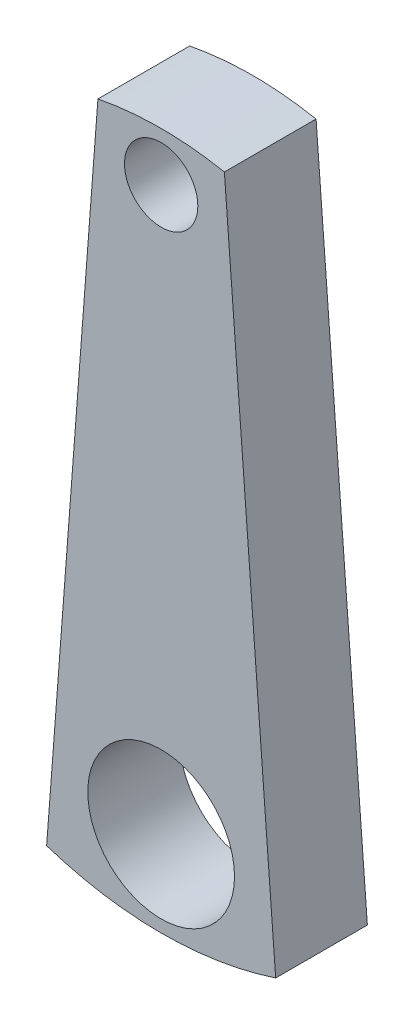
ISO-10303-21;
HEADER;
FILE_DESCRIPTION(('STEP AP214'),'2;1');
FILE_NAME('part.step','',(''),(''),'','','');
FILE_SCHEMA(('AUTOMOTIVE_DESIGN { 1 0 10303 214 1 1 1 1 }'));
ENDSEC;
DATA;
#1=APPLICATION_CONTEXT('core data for automotive mechanical design processes');
#2=APPLICATION_PROTOCOL_DEFINITION('international standard','automotive_design',2000,#1);
#3=PRODUCT_CONTEXT('',#1,'mechanical');
#4=PRODUCT('Part','Part','',(#3));
#5=PRODUCT_RELATED_PRODUCT_CATEGORY('part','',(#4));
#6=PRODUCT_DEFINITION_FORMATION('','',#4);
#7=PRODUCT_DEFINITION_CONTEXT('part definition',#1,'design');
#8=PRODUCT_DEFINITION('design','',#6,#7);
#9=PRODUCT_DEFINITION_SHAPE('','',#8);
#10=(LENGTH_UNIT() NAMED_UNIT(*) SI_UNIT(.MILLI.,.METRE.));
#11=(NAMED_UNIT(*) PLANE_ANGLE_UNIT() SI_UNIT($,.RADIAN.));
#12=(NAMED_UNIT(*) SI_UNIT($,.STERADIAN.) SOLID_ANGLE_UNIT());
#13=UNCERTAINTY_MEASURE_WITH_UNIT(LENGTH_MEASURE(1.E-05),#10,'distance_accuracy_value','');
#14=(GEOMETRIC_REPRESENTATION_CONTEXT(3) GLOBAL_UNCERTAINTY_ASSIGNED_CONTEXT((#13)) GLOBAL_UNIT_ASSIGNED_CONTEXT((#10,
#11,#12)) REPRESENTATION_CONTEXT('',''));
#15=CARTESIAN_POINT('',(0.,0.,0.));
#16=DIRECTION('',(0.,0.,1.));
#17=DIRECTION('',(1.,0.,0.));
#18=AXIS2_PLACEMENT_3D('',#15,#16,#17);
#19=CARTESIAN_POINT('',(0.,0.,15.));
#20=DIRECTION('',(0.,0.,1.));
#21=DIRECTION('',(1.,0.,0.));
#22=AXIS2_PLACEMENT_3D('',#19,#20,#21);
#23=PLANE('',#22);
#24=CARTESIAN_POINT('',(0.,46.,15.));
#25=DIRECTION('',(0.,0.,1.));
#26=DIRECTION('',(1.,0.,0.));
#27=AXIS2_PLACEMENT_3D('',#24,#25,#26);
#28=CIRCLE('',#27,6.);
#29=CARTESIAN_POINT('',(6.,46.,15.));
#30=VERTEX_POINT('',#29);
#31=EDGE_CURVE('E99',#30,#30,#28,.T.);
#32=ORIENTED_EDGE('',*,*,#31,.F.);
#33=EDGE_LOOP('',(#32));
#34=FACE_BOUND('',#33,.T.);
#35=CARTESIAN_POINT('',(0.,0.,15.));
#36=DIRECTION('',(0.,0.,1.));
#37=DIRECTION('',(1.,0.,0.));
#38=AXIS2_PLACEMENT_3D('',#35,#36,#37);
#39=CIRCLE('',#38,54.);
#40=CARTESIAN_POINT('',(10.3440804327886,53.,15.));
#41=VERTEX_POINT('',#40);
#42=CARTESIAN_POINT('',(-10.3440804327886,53.,15.));
#43=VERTEX_POINT('',#42);
#44=EDGE_CURVE('E84',#41,#43,#39,.T.);
#45=ORIENTED_EDGE('',*,*,#44,.T.);
#46=DIRECTION('',(-0.0760600643658096,-0.997103237688389,0.));
#47=VECTOR('',#46,1.);
#48=CARTESIAN_POINT('',(-10.3440804327886,53.,15.));
#49=LINE('',#48,#47);
#50=CARTESIAN_POINT('',(-18.7349939951952,-57.,15.));
#51=VERTEX_POINT('',#50);
#52=EDGE_CURVE('E79',#43,#51,#49,.T.);
#53=ORIENTED_EDGE('',*,*,#52,.T.);
#54=CARTESIAN_POINT('',(0.,0.,15.));
#55=DIRECTION('',(0.,0.,1.));
#56=DIRECTION('',(1.,0.,0.));
#57=AXIS2_PLACEMENT_3D('',#54,#55,#56);
#58=CIRCLE('',#57,60.);
#59=CARTESIAN_POINT('',(18.7349939951952,-57.,15.));
#60=VERTEX_POINT('',#59);
#61=EDGE_CURVE('E82',#51,#60,#58,.T.);
#62=ORIENTED_EDGE('',*,*,#61,.T.);
#63=DIRECTION('',(-0.0760600643658098,0.997103237688389,0.));
#64=VECTOR('',#63,1.);
#65=CARTESIAN_POINT('',(10.3440804327886,53.,15.));
#66=LINE('',#65,#64);
#67=EDGE_CURVE('E49',#60,#41,#66,.T.);
#68=ORIENTED_EDGE('',*,*,#67,.T.);
#69=EDGE_LOOP('',(#45,#53,#62,#68));
#70=FACE_BOUND('',#69,.T.);
#71=CARTESIAN_POINT('',(0.,-46.,15.));
#72=DIRECTION('',(0.,0.,1.));
#73=DIRECTION('',(1.,0.,0.));
#74=AXIS2_PLACEMENT_3D('',#71,#72,#73);
#75=CIRCLE('',#74,12.);
#76=CARTESIAN_POINT('',(12.,-46.,15.));
#77=VERTEX_POINT('',#76);
#78=EDGE_CURVE('E114',#77,#77,#75,.T.);
#79=ORIENTED_EDGE('',*,*,#78,.F.);
#80=EDGE_LOOP('',(#79));
#81=FACE_BOUND('',#80,.T.);
#82=ADVANCED_FACE('F32',(#34,#70,#81),#23,.T.);
#83=CARTESIAN_POINT('',(0.,0.,0.));
#84=DIRECTION('',(0.,0.,1.));
#85=DIRECTION('',(1.,0.,0.));
#86=AXIS2_PLACEMENT_3D('',#83,#84,#85);
#87=PLANE('',#86);
#88=CARTESIAN_POINT('',(0.,46.,0.));
#89=DIRECTION('',(0.,0.,1.));
#90=DIRECTION('',(1.,0.,0.));
#91=AXIS2_PLACEMENT_3D('',#88,#89,#90);
#92=CIRCLE('',#91,6.);
#93=CARTESIAN_POINT('',(6.,46.,0.));
#94=VERTEX_POINT('',#93);
#95=EDGE_CURVE('E111',#94,#94,#92,.T.);
#96=ORIENTED_EDGE('',*,*,#95,.T.);
#97=EDGE_LOOP('',(#96));
#98=FACE_BOUND('',#97,.T.);
#99=CARTESIAN_POINT('',(0.,0.,0.));
#100=DIRECTION('',(0.,0.,1.));
#101=DIRECTION('',(1.,0.,0.));
#102=AXIS2_PLACEMENT_3D('',#99,#100,#101);
#103=CIRCLE('',#102,54.);
#104=CARTESIAN_POINT('',(10.3440804327886,53.,0.));
#105=VERTEX_POINT('',#104);
#106=CARTESIAN_POINT('',(-10.3440804327886,53.,0.));
#107=VERTEX_POINT('',#106);
#108=EDGE_CURVE('E96',#105,#107,#103,.T.);
#109=ORIENTED_EDGE('',*,*,#108,.F.);
#110=DIRECTION('',(-0.0760600643658098,0.997103237688389,0.));
#111=VECTOR('',#110,1.);
#112=CARTESIAN_POINT('',(10.3440804327886,53.,0.));
#113=LINE('',#112,#111);
#114=CARTESIAN_POINT('',(18.7349939951952,-57.,0.));
#115=VERTEX_POINT('',#114);
#116=EDGE_CURVE('E72',#115,#105,#113,.T.);
#117=ORIENTED_EDGE('',*,*,#116,.F.);
#118=CARTESIAN_POINT('',(0.,0.,0.));
#119=DIRECTION('',(0.,0.,1.));
#120=DIRECTION('',(1.,0.,0.));
#121=AXIS2_PLACEMENT_3D('',#118,#119,#120);
#122=CIRCLE('',#121,60.);
#123=CARTESIAN_POINT('',(-18.7349939951952,-57.,0.));
#124=VERTEX_POINT('',#123);
#125=EDGE_CURVE('E66',#124,#115,#122,.T.);
#126=ORIENTED_EDGE('',*,*,#125,.F.);
#127=DIRECTION('',(-0.0760600643658096,-0.997103237688389,0.));
#128=VECTOR('',#127,1.);
#129=CARTESIAN_POINT('',(-10.3440804327886,53.,0.));
#130=LINE('',#129,#128);
#131=EDGE_CURVE('E88',#107,#124,#130,.T.);
#132=ORIENTED_EDGE('',*,*,#131,.F.);
#133=EDGE_LOOP('',(#109,#117,#126,#132));
#134=FACE_BOUND('',#133,.T.);
#135=CARTESIAN_POINT('',(0.,-46.,0.));
#136=DIRECTION('',(0.,0.,1.));
#137=DIRECTION('',(1.,0.,0.));
#138=AXIS2_PLACEMENT_3D('',#135,#136,#137);
#139=CIRCLE('',#138,12.);
#140=CARTESIAN_POINT('',(12.,-46.,0.));
#141=VERTEX_POINT('',#140);
#142=EDGE_CURVE('E117',#141,#141,#139,.T.);
#143=ORIENTED_EDGE('',*,*,#142,.T.);
#144=EDGE_LOOP('',(#143));
#145=FACE_BOUND('',#144,.T.);
#146=ADVANCED_FACE('F107',(#98,#134,#145),#87,.F.);
#147=CARTESIAN_POINT('',(0.,0.,15.));
#148=DIRECTION('',(0.,0.,-1.));
#149=DIRECTION('',(-1.,0.,0.));
#150=AXIS2_PLACEMENT_3D('',#147,#148,#149);
#151=CYLINDRICAL_SURFACE('',#150,54.);
#152=ORIENTED_EDGE('',*,*,#108,.T.);
#153=DIRECTION('',(0.,0.,-1.));
#154=VECTOR('',#153,1.);
#155=CARTESIAN_POINT('',(-10.3440804327886,53.,15.));
#156=LINE('',#155,#154);
#157=EDGE_CURVE('E11',#43,#107,#156,.T.);
#158=ORIENTED_EDGE('',*,*,#157,.F.);
#159=ORIENTED_EDGE('',*,*,#44,.F.);
#160=DIRECTION('',(0.,0.,-1.));
#161=VECTOR('',#160,1.);
#162=CARTESIAN_POINT('',(10.3440804327886,53.,15.));
#163=LINE('',#162,#161);
#164=EDGE_CURVE('E92',#41,#105,#163,.T.);
#165=ORIENTED_EDGE('',*,*,#164,.T.);
#166=EDGE_LOOP('',(#152,#158,#159,#165));
#167=FACE_BOUND('',#166,.T.);
#168=ADVANCED_FACE('F34',(#167),#151,.T.);
#169=CARTESIAN_POINT('',(-10.3440804327886,53.,15.));
#170=DIRECTION('',(0.997103237688389,-0.0760600643658096,0.));
#171=DIRECTION('',(0.0760600643658096,0.997103237688389,0.));
#172=AXIS2_PLACEMENT_3D('',#169,#170,#171);
#173=PLANE('',#172);
#174=ORIENTED_EDGE('',*,*,#131,.T.);
#175=DIRECTION('',(0.,0.,-1.));
#176=VECTOR('',#175,1.);
#177=CARTESIAN_POINT('',(-18.7349939951952,-57.,15.));
#178=LINE('',#177,#176);
#179=EDGE_CURVE('E41',#51,#124,#178,.T.);
#180=ORIENTED_EDGE('',*,*,#179,.F.);
#181=ORIENTED_EDGE('',*,*,#52,.F.);
#182=ORIENTED_EDGE('',*,*,#157,.T.);
#183=EDGE_LOOP('',(#174,#180,#181,#182));
#184=FACE_BOUND('',#183,.T.);
#185=ADVANCED_FACE('F87',(#184),#173,.F.);
#186=CARTESIAN_POINT('',(0.,0.,15.));
#187=DIRECTION('',(0.,0.,-1.));
#188=DIRECTION('',(-1.,0.,0.));
#189=AXIS2_PLACEMENT_3D('',#186,#187,#188);
#190=CYLINDRICAL_SURFACE('',#189,60.);
#191=ORIENTED_EDGE('',*,*,#125,.T.);
#192=DIRECTION('',(0.,0.,-1.));
#193=VECTOR('',#192,1.);
#194=CARTESIAN_POINT('',(18.7349939951952,-57.,15.));
#195=LINE('',#194,#193);
#196=EDGE_CURVE('E89',#60,#115,#195,.T.);
#197=ORIENTED_EDGE('',*,*,#196,.F.);
#198=ORIENTED_EDGE('',*,*,#61,.F.);
#199=ORIENTED_EDGE('',*,*,#179,.T.);
#200=EDGE_LOOP('',(#191,#197,#198,#199));
#201=FACE_BOUND('',#200,.T.);
#202=ADVANCED_FACE('F90',(#201),#190,.T.);
#203=CARTESIAN_POINT('',(10.3440804327886,53.,15.));
#204=DIRECTION('',(-0.997103237688389,-0.0760600643658098,0.));
#205=DIRECTION('',(0.0760600643658098,-0.997103237688389,0.));
#206=AXIS2_PLACEMENT_3D('',#203,#204,#205);
#207=PLANE('',#206);
#208=ORIENTED_EDGE('',*,*,#116,.T.);
#209=ORIENTED_EDGE('',*,*,#164,.F.);
#210=ORIENTED_EDGE('',*,*,#67,.F.);
#211=ORIENTED_EDGE('',*,*,#196,.T.);
#212=EDGE_LOOP('',(#208,#209,#210,#211));
#213=FACE_BOUND('',#212,.T.);
#214=ADVANCED_FACE('F104',(#213),#207,.F.);
#215=CARTESIAN_POINT('',(0.,46.,15.));
#216=DIRECTION('',(0.,0.,-1.));
#217=DIRECTION('',(-1.,0.,0.));
#218=AXIS2_PLACEMENT_3D('',#215,#216,#217);
#219=CYLINDRICAL_SURFACE('',#218,6.);
#220=ORIENTED_EDGE('',*,*,#31,.T.);
#221=EDGE_LOOP('',(#220));
#222=FACE_BOUND('',#221,.T.);
#223=ORIENTED_EDGE('',*,*,#95,.F.);
#224=EDGE_LOOP('',(#223));
#225=FACE_BOUND('',#224,.T.);
#226=ADVANCED_FACE('F135',(#222,#225),#219,.F.);
#227=CARTESIAN_POINT('',(0.,-46.,15.));
#228=DIRECTION('',(0.,0.,-1.));
#229=DIRECTION('',(-1.,0.,0.));
#230=AXIS2_PLACEMENT_3D('',#227,#228,#229);
#231=CYLINDRICAL_SURFACE('',#230,12.);
#232=ORIENTED_EDGE('',*,*,#78,.T.);
#233=EDGE_LOOP('',(#232));
#234=FACE_BOUND('',#233,.T.);
#235=ORIENTED_EDGE('',*,*,#142,.F.);
#236=EDGE_LOOP('',(#235));
#237=FACE_BOUND('',#236,.T.);
#238=ADVANCED_FACE('F123',(#234,#237),#231,.F.);
#239=CLOSED_SHELL('',(#82,#146,#168,#185,#202,#214,#226,#238));
#240=MANIFOLD_SOLID_BREP('B2',#239);
#241=ADVANCED_BREP_SHAPE_REPRESENTATION('',(#18,#240),#14);
#242=SHAPE_DEFINITION_REPRESENTATION(#9,#241);
ENDSEC;
END-ISO-10303-21;
